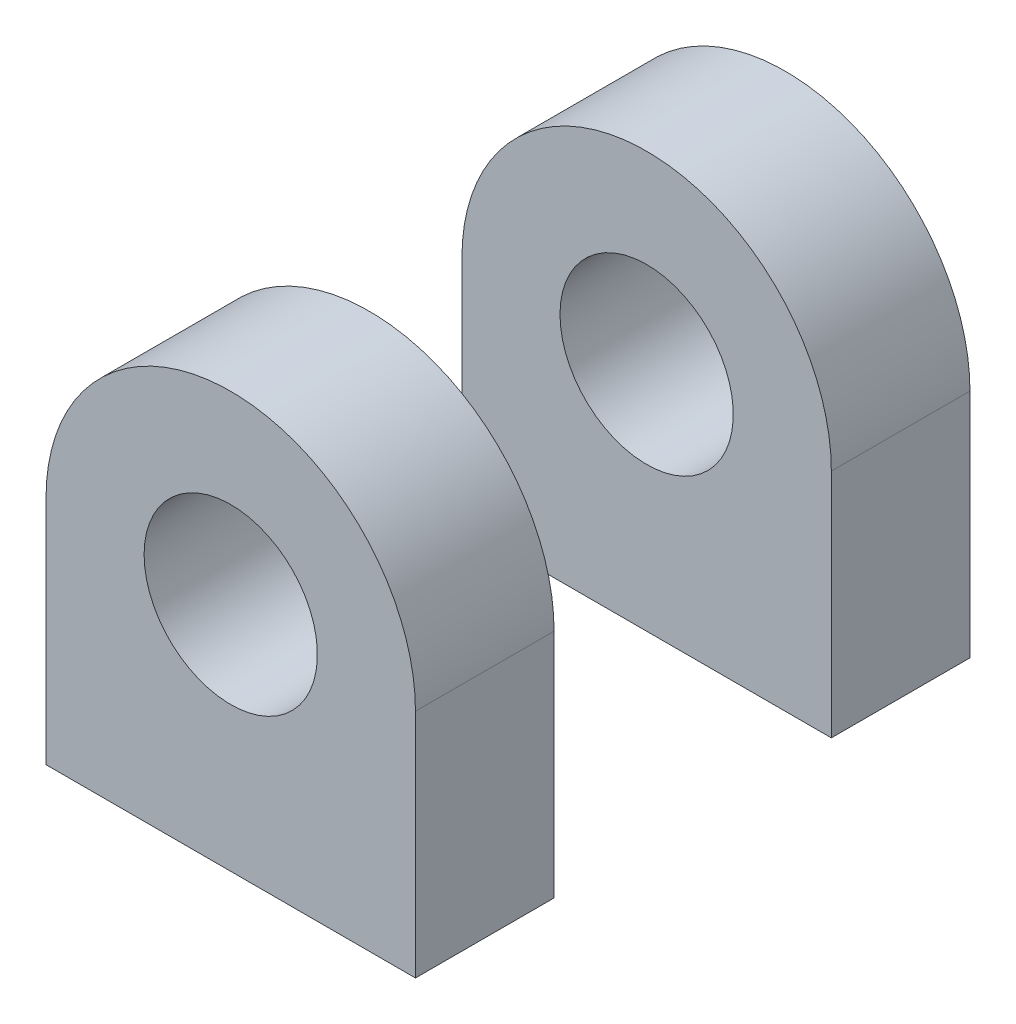
ISO-10303-21;
HEADER;
FILE_DESCRIPTION(('STEP AP214'),'2;1');
FILE_NAME('part.step','',(''),(''),'','','');
FILE_SCHEMA(('AUTOMOTIVE_DESIGN { 1 0 10303 214 1 1 1 1 }'));
ENDSEC;
DATA;
#1=APPLICATION_CONTEXT('core data for automotive mechanical design processes');
#2=APPLICATION_PROTOCOL_DEFINITION('international standard','automotive_design',2000,#1);
#3=PRODUCT_CONTEXT('',#1,'mechanical');
#4=PRODUCT('Part','Part','',(#3));
#5=PRODUCT_RELATED_PRODUCT_CATEGORY('part','',(#4));
#6=PRODUCT_DEFINITION_FORMATION('','',#4);
#7=PRODUCT_DEFINITION_CONTEXT('part definition',#1,'design');
#8=PRODUCT_DEFINITION('design','',#6,#7);
#9=PRODUCT_DEFINITION_SHAPE('','',#8);
#10=(LENGTH_UNIT() NAMED_UNIT(*) SI_UNIT(.MILLI.,.METRE.));
#11=(NAMED_UNIT(*) PLANE_ANGLE_UNIT() SI_UNIT($,.RADIAN.));
#12=(NAMED_UNIT(*) SI_UNIT($,.STERADIAN.) SOLID_ANGLE_UNIT());
#13=UNCERTAINTY_MEASURE_WITH_UNIT(LENGTH_MEASURE(1.E-05),#10,'distance_accuracy_value','');
#14=(GEOMETRIC_REPRESENTATION_CONTEXT(3) GLOBAL_UNCERTAINTY_ASSIGNED_CONTEXT((#13)) GLOBAL_UNIT_ASSIGNED_CONTEXT((#10,
#11,#12)) REPRESENTATION_CONTEXT('',''));
#15=CARTESIAN_POINT('',(0.,0.,0.));
#16=DIRECTION('',(0.,0.,1.));
#17=DIRECTION('',(1.,0.,0.));
#18=AXIS2_PLACEMENT_3D('',#15,#16,#17);
#19=CARTESIAN_POINT('',(5.0766568726894,6.35,7.62));
#20=DIRECTION('',(0.,0.,-1.));
#21=DIRECTION('',(-1.,0.,0.));
#22=AXIS2_PLACEMENT_3D('',#19,#20,#21);
#23=CYLINDRICAL_SURFACE('',#22,5.0766568726894);
#24=CARTESIAN_POINT('',(5.0766568726894,6.35,3.81));
#25=DIRECTION('',(0.,0.,1.));
#26=DIRECTION('',(1.,0.,0.));
#27=AXIS2_PLACEMENT_3D('',#24,#25,#26);
#28=CIRCLE('',#27,5.0766568726894);
#29=CARTESIAN_POINT('',(0.,6.35,3.81));
#30=VERTEX_POINT('',#29);
#31=CARTESIAN_POINT('',(10.1533137453788,6.35,3.81));
#32=VERTEX_POINT('',#31);
#33=EDGE_CURVE('E78',#30,#32,#28,.F.);
#34=ORIENTED_EDGE('',*,*,#33,.F.);
#35=DIRECTION('',(0.,0.,-1.));
#36=VECTOR('',#35,1.);
#37=CARTESIAN_POINT('',(0.,6.35,7.62));
#38=LINE('',#37,#36);
#39=CARTESIAN_POINT('',(0.,6.35,7.62));
#40=VERTEX_POINT('',#39);
#41=EDGE_CURVE('E95',#40,#30,#38,.T.);
#42=ORIENTED_EDGE('',*,*,#41,.F.);
#43=CARTESIAN_POINT('',(5.0766568726894,6.35,7.62));
#44=DIRECTION('',(0.,0.,1.));
#45=DIRECTION('',(1.,0.,0.));
#46=AXIS2_PLACEMENT_3D('',#43,#44,#45);
#47=CIRCLE('',#46,5.0766568726894);
#48=CARTESIAN_POINT('',(10.1533137453788,6.35,7.62));
#49=VERTEX_POINT('',#48);
#50=EDGE_CURVE('E98',#40,#49,#47,.F.);
#51=ORIENTED_EDGE('',*,*,#50,.T.);
#52=DIRECTION('',(0.,0.,-1.));
#53=VECTOR('',#52,1.);
#54=CARTESIAN_POINT('',(10.1533137453788,6.35,7.62));
#55=LINE('',#54,#53);
#56=EDGE_CURVE('E53',#49,#32,#55,.T.);
#57=ORIENTED_EDGE('',*,*,#56,.T.);
#58=EDGE_LOOP('',(#34,#42,#51,#57));
#59=FACE_BOUND('',#58,.T.);
#60=ADVANCED_FACE('F50',(#59),#23,.T.);
#61=CARTESIAN_POINT('',(0.,0.,7.62));
#62=DIRECTION('',(-1.,0.,0.));
#63=DIRECTION('',(0.,0.,1.));
#64=AXIS2_PLACEMENT_3D('',#61,#62,#63);
#65=PLANE('',#64);
#66=DIRECTION('',(0.,1.,0.));
#67=VECTOR('',#66,1.);
#68=CARTESIAN_POINT('',(0.,0.,3.81));
#69=LINE('',#68,#67);
#70=CARTESIAN_POINT('',(0.,0.,3.81));
#71=VERTEX_POINT('',#70);
#72=EDGE_CURVE('E12',#71,#30,#69,.T.);
#73=ORIENTED_EDGE('',*,*,#72,.F.);
#74=DIRECTION('',(0.,0.,-1.));
#75=VECTOR('',#74,1.);
#76=CARTESIAN_POINT('',(0.,0.,7.62));
#77=LINE('',#76,#75);
#78=CARTESIAN_POINT('',(0.,0.,7.62));
#79=VERTEX_POINT('',#78);
#80=EDGE_CURVE('E89',#79,#71,#77,.T.);
#81=ORIENTED_EDGE('',*,*,#80,.F.);
#82=DIRECTION('',(0.,1.,0.));
#83=VECTOR('',#82,1.);
#84=CARTESIAN_POINT('',(0.,0.,7.62));
#85=LINE('',#84,#83);
#86=EDGE_CURVE('E99',#79,#40,#85,.T.);
#87=ORIENTED_EDGE('',*,*,#86,.T.);
#88=ORIENTED_EDGE('',*,*,#41,.T.);
#89=EDGE_LOOP('',(#73,#81,#87,#88));
#90=FACE_BOUND('',#89,.T.);
#91=ADVANCED_FACE('F108',(#90),#65,.T.);
#92=CARTESIAN_POINT('',(0.,0.,7.62));
#93=DIRECTION('',(0.,1.,0.));
#94=DIRECTION('',(0.,0.,1.));
#95=AXIS2_PLACEMENT_3D('',#92,#93,#94);
#96=PLANE('',#95);
#97=ORIENTED_EDGE('',*,*,#80,.T.);
#98=DIRECTION('',(-1.,0.,0.));
#99=VECTOR('',#98,1.);
#100=CARTESIAN_POINT('',(25.4,0.,3.81));
#101=LINE('',#100,#99);
#102=CARTESIAN_POINT('',(10.1533137453788,0.,3.81));
#103=VERTEX_POINT('',#102);
#104=EDGE_CURVE('E59',#103,#71,#101,.T.);
#105=ORIENTED_EDGE('',*,*,#104,.F.);
#106=DIRECTION('',(0.,0.,-1.));
#107=VECTOR('',#106,1.);
#108=CARTESIAN_POINT('',(10.1533137453788,0.,7.62));
#109=LINE('',#108,#107);
#110=CARTESIAN_POINT('',(10.1533137453788,0.,7.62));
#111=VERTEX_POINT('',#110);
#112=EDGE_CURVE('E117',#111,#103,#109,.T.);
#113=ORIENTED_EDGE('',*,*,#112,.F.);
#114=DIRECTION('',(1.,0.,0.));
#115=VECTOR('',#114,1.);
#116=CARTESIAN_POINT('',(0.,0.,7.62));
#117=LINE('',#116,#115);
#118=EDGE_CURVE('E111',#79,#111,#117,.T.);
#119=ORIENTED_EDGE('',*,*,#118,.F.);
#120=EDGE_LOOP('',(#97,#105,#113,#119));
#121=FACE_BOUND('',#120,.T.);
#122=ADVANCED_FACE('F128',(#121),#96,.F.);
#123=CARTESIAN_POINT('',(5.0766568726894,6.35,7.62));
#124=DIRECTION('',(0.,0.,-1.));
#125=DIRECTION('',(-1.,0.,0.));
#126=AXIS2_PLACEMENT_3D('',#123,#124,#125);
#127=CYLINDRICAL_SURFACE('',#126,2.38125);
#128=CARTESIAN_POINT('',(5.0766568726894,6.35,3.81));
#129=DIRECTION('',(0.,0.,1.));
#130=DIRECTION('',(1.,0.,0.));
#131=AXIS2_PLACEMENT_3D('',#128,#129,#130);
#132=CIRCLE('',#131,2.38125);
#133=CARTESIAN_POINT('',(2.6954068726894,6.35,3.81));
#134=VERTEX_POINT('',#133);
#135=EDGE_CURVE('E118',#134,#134,#132,.T.);
#136=CARTESIAN_POINT('',(5.0766568726894,6.35,7.62));
#137=DIRECTION('',(0.,0.,1.));
#138=DIRECTION('',(1.,0.,0.));
#139=AXIS2_PLACEMENT_3D('',#136,#137,#138);
#140=CIRCLE('',#139,2.38125);
#141=CARTESIAN_POINT('',(2.6954068726894,6.35,7.62));
#142=VERTEX_POINT('',#141);
#143=EDGE_CURVE('E114',#142,#142,#140,.T.);
#144=CARTESIAN_POINT('',(2.6954068726894,6.35,3.81));
#145=CARTESIAN_POINT('',(2.6954068726894,6.35,3.8496875));
#146=CARTESIAN_POINT('',(2.6954068726894,6.35,3.889375));
#147=CARTESIAN_POINT('',(2.6954068726894,6.35,3.96875));
#148=CARTESIAN_POINT('',(2.6954068726894,6.35,4.0084375));
#149=CARTESIAN_POINT('',(2.6954068726894,6.35,4.0878125));
#150=CARTESIAN_POINT('',(2.6954068726894,6.35,4.1275));
#151=CARTESIAN_POINT('',(2.6954068726894,6.35,4.206875));
#152=CARTESIAN_POINT('',(2.6954068726894,6.35,4.2465625));
#153=CARTESIAN_POINT('',(2.6954068726894,6.35,4.3259375));
#154=CARTESIAN_POINT('',(2.6954068726894,6.35,4.365625));
#155=CARTESIAN_POINT('',(2.6954068726894,6.35,4.445));
#156=CARTESIAN_POINT('',(2.6954068726894,6.35,4.4846875));
#157=CARTESIAN_POINT('',(2.6954068726894,6.35,4.5640625));
#158=CARTESIAN_POINT('',(2.6954068726894,6.35,4.60375));
#159=CARTESIAN_POINT('',(2.6954068726894,6.35,4.683125));
#160=CARTESIAN_POINT('',(2.6954068726894,6.35,4.7228125));
#161=CARTESIAN_POINT('',(2.6954068726894,6.35,4.8021875));
#162=CARTESIAN_POINT('',(2.6954068726894,6.35,4.841875));
#163=CARTESIAN_POINT('',(2.6954068726894,6.35,4.92125));
#164=CARTESIAN_POINT('',(2.6954068726894,6.35,4.9609375));
#165=CARTESIAN_POINT('',(2.6954068726894,6.35,5.0403125));
#166=CARTESIAN_POINT('',(2.6954068726894,6.35,5.08));
#167=CARTESIAN_POINT('',(2.6954068726894,6.35,5.159375));
#168=CARTESIAN_POINT('',(2.6954068726894,6.35,5.1990625));
#169=CARTESIAN_POINT('',(2.6954068726894,6.35,5.2784375));
#170=CARTESIAN_POINT('',(2.6954068726894,6.35,5.318125));
#171=CARTESIAN_POINT('',(2.6954068726894,6.35,5.3975));
#172=CARTESIAN_POINT('',(2.6954068726894,6.35,5.4371875));
#173=CARTESIAN_POINT('',(2.6954068726894,6.35,5.5165625));
#174=CARTESIAN_POINT('',(2.6954068726894,6.35,5.55625));
#175=CARTESIAN_POINT('',(2.6954068726894,6.35,5.635625));
#176=CARTESIAN_POINT('',(2.6954068726894,6.35,5.6753125));
#177=CARTESIAN_POINT('',(2.6954068726894,6.35,5.7546875));
#178=CARTESIAN_POINT('',(2.6954068726894,6.35,5.794375));
#179=CARTESIAN_POINT('',(2.6954068726894,6.35,5.87375));
#180=CARTESIAN_POINT('',(2.6954068726894,6.35,5.9134375));
#181=CARTESIAN_POINT('',(2.6954068726894,6.35,5.9928125));
#182=CARTESIAN_POINT('',(2.6954068726894,6.35,6.0325));
#183=CARTESIAN_POINT('',(2.6954068726894,6.35,6.111875));
#184=CARTESIAN_POINT('',(2.6954068726894,6.35,6.1515625));
#185=CARTESIAN_POINT('',(2.6954068726894,6.35,6.2309375));
#186=CARTESIAN_POINT('',(2.6954068726894,6.35,6.270625));
#187=CARTESIAN_POINT('',(2.6954068726894,6.35,6.35));
#188=CARTESIAN_POINT('',(2.6954068726894,6.35,6.3896875));
#189=CARTESIAN_POINT('',(2.6954068726894,6.35,6.4690625));
#190=CARTESIAN_POINT('',(2.6954068726894,6.35,6.50875));
#191=CARTESIAN_POINT('',(2.6954068726894,6.35,6.588125));
#192=CARTESIAN_POINT('',(2.6954068726894,6.35,6.6278125));
#193=CARTESIAN_POINT('',(2.6954068726894,6.35,6.7071875));
#194=CARTESIAN_POINT('',(2.6954068726894,6.35,6.746875));
#195=CARTESIAN_POINT('',(2.6954068726894,6.35,6.82625));
#196=CARTESIAN_POINT('',(2.6954068726894,6.35,6.8659375));
#197=CARTESIAN_POINT('',(2.6954068726894,6.35,6.9453125));
#198=CARTESIAN_POINT('',(2.6954068726894,6.35,6.985));
#199=CARTESIAN_POINT('',(2.6954068726894,6.35,7.064375));
#200=CARTESIAN_POINT('',(2.6954068726894,6.35,7.1040625));
#201=CARTESIAN_POINT('',(2.6954068726894,6.35,7.1834375));
#202=CARTESIAN_POINT('',(2.6954068726894,6.35,7.223125));
#203=CARTESIAN_POINT('',(2.6954068726894,6.35,7.3025));
#204=CARTESIAN_POINT('',(2.6954068726894,6.35,7.3421875));
#205=CARTESIAN_POINT('',(2.6954068726894,6.35,7.4215625));
#206=CARTESIAN_POINT('',(2.6954068726894,6.35,7.46125));
#207=CARTESIAN_POINT('',(2.6954068726894,6.35,7.540625));
#208=CARTESIAN_POINT('',(2.6954068726894,6.35,7.5803125));
#209=CARTESIAN_POINT('',(2.6954068726894,6.35,7.62));
#210=B_SPLINE_CURVE_WITH_KNOTS('',3,(#144,#145,#146,#147,#148,#149,#150,#151,#152,#153,#154,
#155,#156,#157,#158,#159,#160,#161,#162,#163,#164,#165,#166,#167,#168,#169,#170,#171,#172,#173,
#174,#175,#176,#177,#178,#179,#180,#181,#182,#183,#184,#185,#186,#187,#188,#189,#190,#191,#192,
#193,#194,#195,#196,#197,#198,#199,#200,#201,#202,#203,#204,#205,#206,#207,#208,#209),
.UNSPECIFIED.,.F.,.F.,(4,2,2,2,2,2,2,2,2,2,2,2,2,2,2,2,2,2,2,2,2,2,2,2,2,2,2,2,2,2,2,2,4),(0.,
0.1190625,0.238125,0.357187499999999,0.476250000000001,0.5953125,0.714374999999999,0.8334375,
0.9525,1.0715625,1.190625,1.3096875,1.42875,1.5478125,1.666875,1.7859375,1.905,2.0240625,
2.143125,2.2621875,2.38125,2.5003125,2.619375,2.7384375,2.8575,2.9765625,3.095625,3.2146875,
3.33375,3.4528125,3.571875,3.6909375,3.81),.UNSPECIFIED.);
#211=EDGE_CURVE('BSEAM147',#134,#142,#210,.T.);
#212=ORIENTED_EDGE('',*,*,#135,.F.);
#213=ORIENTED_EDGE('',*,*,#143,.T.);
#214=ORIENTED_EDGE('',*,*,#211,.T.);
#215=ORIENTED_EDGE('',*,*,#211,.F.);
#216=EDGE_LOOP('',(#212,#214,#213,#215));
#217=FACE_BOUND('',#216,.T.);
#218=ADVANCED_FACE('F147',(#217),#127,.F.);
#219=CARTESIAN_POINT('',(10.1533137453788,0.,7.62));
#220=DIRECTION('',(-1.,0.,0.));
#221=DIRECTION('',(0.,0.,1.));
#222=AXIS2_PLACEMENT_3D('',#219,#220,#221);
#223=PLANE('',#222);
#224=ORIENTED_EDGE('',*,*,#112,.T.);
#225=DIRECTION('',(0.,1.,0.));
#226=VECTOR('',#225,1.);
#227=CARTESIAN_POINT('',(10.1533137453788,0.,3.81));
#228=LINE('',#227,#226);
#229=EDGE_CURVE('E74',#103,#32,#228,.T.);
#230=ORIENTED_EDGE('',*,*,#229,.T.);
#231=ORIENTED_EDGE('',*,*,#56,.F.);
#232=DIRECTION('',(0.,1.,0.));
#233=VECTOR('',#232,1.);
#234=CARTESIAN_POINT('',(10.1533137453788,0.,7.62));
#235=LINE('',#234,#233);
#236=EDGE_CURVE('E105',#111,#49,#235,.T.);
#237=ORIENTED_EDGE('',*,*,#236,.F.);
#238=EDGE_LOOP('',(#224,#230,#231,#237));
#239=FACE_BOUND('',#238,.T.);
#240=ADVANCED_FACE('F136',(#239),#223,.F.);
#241=CARTESIAN_POINT('',(0.,0.,7.62));
#242=DIRECTION('',(0.,0.,1.));
#243=DIRECTION('',(1.,0.,0.));
#244=AXIS2_PLACEMENT_3D('',#241,#242,#243);
#245=PLANE('',#244);
#246=ORIENTED_EDGE('',*,*,#143,.F.);
#247=EDGE_LOOP('',(#246));
#248=FACE_BOUND('',#247,.T.);
#249=ORIENTED_EDGE('',*,*,#50,.F.);
#250=ORIENTED_EDGE('',*,*,#86,.F.);
#251=ORIENTED_EDGE('',*,*,#118,.T.);
#252=ORIENTED_EDGE('',*,*,#236,.T.);
#253=EDGE_LOOP('',(#249,#250,#251,#252));
#254=FACE_BOUND('',#253,.T.);
#255=ADVANCED_FACE('F103',(#248,#254),#245,.T.);
#256=CARTESIAN_POINT('',(25.4,0.,3.81));
#257=DIRECTION('',(0.,0.,1.));
#258=DIRECTION('',(1.,0.,0.));
#259=AXIS2_PLACEMENT_3D('',#256,#257,#258);
#260=PLANE('',#259);
#261=ORIENTED_EDGE('',*,*,#135,.T.);
#262=EDGE_LOOP('',(#261));
#263=FACE_BOUND('',#262,.T.);
#264=ORIENTED_EDGE('',*,*,#33,.T.);
#265=ORIENTED_EDGE('',*,*,#229,.F.);
#266=ORIENTED_EDGE('',*,*,#104,.T.);
#267=ORIENTED_EDGE('',*,*,#72,.T.);
#268=EDGE_LOOP('',(#264,#265,#266,#267));
#269=FACE_BOUND('',#268,.T.);
#270=ADVANCED_FACE('F129',(#263,#269),#260,.F.);
#271=CLOSED_SHELL('',(#60,#91,#122,#218,#240,#255,#270));
#272=MANIFOLD_SOLID_BREP('B2',#271);
#273=CARTESIAN_POINT('',(5.0766568726894,6.35,7.62));
#274=DIRECTION('',(0.,0.,-1.));
#275=DIRECTION('',(-1.,0.,0.));
#276=AXIS2_PLACEMENT_3D('',#273,#274,#275);
#277=CYLINDRICAL_SURFACE('',#276,2.38125);
#278=CARTESIAN_POINT('',(5.0766568726894,6.35,-7.62));
#279=DIRECTION('',(0.,0.,1.));
#280=DIRECTION('',(1.,0.,0.));
#281=AXIS2_PLACEMENT_3D('',#278,#279,#280);
#282=CIRCLE('',#281,2.38125);
#283=CARTESIAN_POINT('',(2.6954068726894,6.35,-7.62));
#284=VERTEX_POINT('',#283);
#285=EDGE_CURVE('E278',#284,#284,#282,.T.);
#286=CARTESIAN_POINT('',(5.0766568726894,6.35,-3.81));
#287=DIRECTION('',(0.,0.,1.));
#288=DIRECTION('',(0.,-1.,0.));
#289=AXIS2_PLACEMENT_3D('',#286,#287,#288);
#290=CIRCLE('',#289,2.38125);
#291=CARTESIAN_POINT('',(2.6954068726894,6.35,-3.81));
#292=VERTEX_POINT('',#291);
#293=EDGE_CURVE('E281',#292,#292,#290,.T.);
#294=CARTESIAN_POINT('',(2.6954068726894,6.35,-7.62));
#295=CARTESIAN_POINT('',(2.6954068726894,6.35,-7.5803125));
#296=CARTESIAN_POINT('',(2.6954068726894,6.35,-7.540625));
#297=CARTESIAN_POINT('',(2.6954068726894,6.35,-7.46125));
#298=CARTESIAN_POINT('',(2.6954068726894,6.35,-7.4215625));
#299=CARTESIAN_POINT('',(2.6954068726894,6.35,-7.3421875));
#300=CARTESIAN_POINT('',(2.6954068726894,6.35,-7.3025));
#301=CARTESIAN_POINT('',(2.6954068726894,6.35,-7.223125));
#302=CARTESIAN_POINT('',(2.6954068726894,6.35,-7.1834375));
#303=CARTESIAN_POINT('',(2.6954068726894,6.35,-7.1040625));
#304=CARTESIAN_POINT('',(2.6954068726894,6.35,-7.064375));
#305=CARTESIAN_POINT('',(2.6954068726894,6.35,-6.985));
#306=CARTESIAN_POINT('',(2.6954068726894,6.35,-6.9453125));
#307=CARTESIAN_POINT('',(2.6954068726894,6.35,-6.8659375));
#308=CARTESIAN_POINT('',(2.6954068726894,6.35,-6.82625));
#309=CARTESIAN_POINT('',(2.6954068726894,6.35,-6.746875));
#310=CARTESIAN_POINT('',(2.6954068726894,6.35,-6.7071875));
#311=CARTESIAN_POINT('',(2.6954068726894,6.35,-6.6278125));
#312=CARTESIAN_POINT('',(2.6954068726894,6.35,-6.588125));
#313=CARTESIAN_POINT('',(2.6954068726894,6.35,-6.50875));
#314=CARTESIAN_POINT('',(2.6954068726894,6.35,-6.4690625));
#315=CARTESIAN_POINT('',(2.6954068726894,6.35,-6.3896875));
#316=CARTESIAN_POINT('',(2.6954068726894,6.35,-6.35));
#317=CARTESIAN_POINT('',(2.6954068726894,6.35,-6.270625));
#318=CARTESIAN_POINT('',(2.6954068726894,6.35,-6.2309375));
#319=CARTESIAN_POINT('',(2.6954068726894,6.35,-6.1515625));
#320=CARTESIAN_POINT('',(2.6954068726894,6.35,-6.111875));
#321=CARTESIAN_POINT('',(2.6954068726894,6.35,-6.0325));
#322=CARTESIAN_POINT('',(2.6954068726894,6.35,-5.9928125));
#323=CARTESIAN_POINT('',(2.6954068726894,6.35,-5.9134375));
#324=CARTESIAN_POINT('',(2.6954068726894,6.35,-5.87375));
#325=CARTESIAN_POINT('',(2.6954068726894,6.35,-5.794375));
#326=CARTESIAN_POINT('',(2.6954068726894,6.35,-5.7546875));
#327=CARTESIAN_POINT('',(2.6954068726894,6.35,-5.6753125));
#328=CARTESIAN_POINT('',(2.6954068726894,6.35,-5.635625));
#329=CARTESIAN_POINT('',(2.6954068726894,6.35,-5.55625));
#330=CARTESIAN_POINT('',(2.6954068726894,6.35,-5.5165625));
#331=CARTESIAN_POINT('',(2.6954068726894,6.35,-5.4371875));
#332=CARTESIAN_POINT('',(2.6954068726894,6.35,-5.3975));
#333=CARTESIAN_POINT('',(2.6954068726894,6.35,-5.318125));
#334=CARTESIAN_POINT('',(2.6954068726894,6.35,-5.2784375));
#335=CARTESIAN_POINT('',(2.6954068726894,6.35,-5.1990625));
#336=CARTESIAN_POINT('',(2.6954068726894,6.35,-5.159375));
#337=CARTESIAN_POINT('',(2.6954068726894,6.35,-5.08));
#338=CARTESIAN_POINT('',(2.6954068726894,6.35,-5.0403125));
#339=CARTESIAN_POINT('',(2.6954068726894,6.35,-4.9609375));
#340=CARTESIAN_POINT('',(2.6954068726894,6.35,-4.92125));
#341=CARTESIAN_POINT('',(2.6954068726894,6.35,-4.841875));
#342=CARTESIAN_POINT('',(2.6954068726894,6.35,-4.8021875));
#343=CARTESIAN_POINT('',(2.6954068726894,6.35,-4.7228125));
#344=CARTESIAN_POINT('',(2.6954068726894,6.35,-4.683125));
#345=CARTESIAN_POINT('',(2.6954068726894,6.35,-4.60375));
#346=CARTESIAN_POINT('',(2.6954068726894,6.35,-4.5640625));
#347=CARTESIAN_POINT('',(2.6954068726894,6.35,-4.4846875));
#348=CARTESIAN_POINT('',(2.6954068726894,6.35,-4.445));
#349=CARTESIAN_POINT('',(2.6954068726894,6.35,-4.365625));
#350=CARTESIAN_POINT('',(2.6954068726894,6.35,-4.3259375));
#351=CARTESIAN_POINT('',(2.6954068726894,6.35,-4.2465625));
#352=CARTESIAN_POINT('',(2.6954068726894,6.35,-4.206875));
#353=CARTESIAN_POINT('',(2.6954068726894,6.35,-4.1275));
#354=CARTESIAN_POINT('',(2.6954068726894,6.35,-4.0878125));
#355=CARTESIAN_POINT('',(2.6954068726894,6.35,-4.0084375));
#356=CARTESIAN_POINT('',(2.6954068726894,6.35,-3.96875));
#357=CARTESIAN_POINT('',(2.6954068726894,6.35,-3.889375));
#358=CARTESIAN_POINT('',(2.6954068726894,6.35,-3.8496875));
#359=CARTESIAN_POINT('',(2.6954068726894,6.35,-3.81));
#360=B_SPLINE_CURVE_WITH_KNOTS('',3,(#294,#295,#296,#297,#298,#299,#300,#301,#302,#303,#304,
#305,#306,#307,#308,#309,#310,#311,#312,#313,#314,#315,#316,#317,#318,#319,#320,#321,#322,#323,
#324,#325,#326,#327,#328,#329,#330,#331,#332,#333,#334,#335,#336,#337,#338,#339,#340,#341,#342,
#343,#344,#345,#346,#347,#348,#349,#350,#351,#352,#353,#354,#355,#356,#357,#358,#359),
.UNSPECIFIED.,.F.,.F.,(4,2,2,2,2,2,2,2,2,2,2,2,2,2,2,2,2,2,2,2,2,2,2,2,2,2,2,2,2,2,2,2,4),(0.,
0.119062499999999,0.238125,0.3571875,0.476249999999999,0.5953125,0.714375,0.833437499999999,
0.952499999999998,1.0715625,1.190625,1.3096875,1.42875,1.5478125,1.666875,1.7859375,1.905,
2.0240625,2.143125,2.2621875,2.38125,2.5003125,2.619375,2.7384375,2.8575,2.9765625,3.095625,
3.2146875,3.33375,3.4528125,3.571875,3.6909375,3.81),.UNSPECIFIED.);
#361=EDGE_CURVE('BSEAM208',#284,#292,#360,.T.);
#362=ORIENTED_EDGE('',*,*,#285,.F.);
#363=ORIENTED_EDGE('',*,*,#293,.T.);
#364=ORIENTED_EDGE('',*,*,#361,.T.);
#365=ORIENTED_EDGE('',*,*,#361,.F.);
#366=EDGE_LOOP('',(#362,#364,#363,#365));
#367=FACE_BOUND('',#366,.T.);
#368=ADVANCED_FACE('F208',(#367),#277,.F.);
#369=CARTESIAN_POINT('',(0.,0.,-7.62));
#370=DIRECTION('',(0.,0.,1.));
#371=DIRECTION('',(1.,0.,0.));
#372=AXIS2_PLACEMENT_3D('',#369,#370,#371);
#373=PLANE('',#372);
#374=ORIENTED_EDGE('',*,*,#285,.T.);
#375=EDGE_LOOP('',(#374));
#376=FACE_BOUND('',#375,.T.);
#377=CARTESIAN_POINT('',(5.0766568726894,6.35,-7.62));
#378=DIRECTION('',(0.,0.,1.));
#379=DIRECTION('',(1.,0.,0.));
#380=AXIS2_PLACEMENT_3D('',#377,#378,#379);
#381=CIRCLE('',#380,5.0766568726894);
#382=CARTESIAN_POINT('',(0.,6.35,-7.62));
#383=VERTEX_POINT('',#382);
#384=CARTESIAN_POINT('',(10.1533137453788,6.35,-7.62));
#385=VERTEX_POINT('',#384);
#386=EDGE_CURVE('E275',#383,#385,#381,.F.);
#387=ORIENTED_EDGE('',*,*,#386,.T.);
#388=DIRECTION('',(0.,1.,0.));
#389=VECTOR('',#388,1.);
#390=CARTESIAN_POINT('',(10.1533137453788,0.,-7.62));
#391=LINE('',#390,#389);
#392=CARTESIAN_POINT('',(10.1533137453788,0.,-7.62));
#393=VERTEX_POINT('',#392);
#394=EDGE_CURVE('E270',#393,#385,#391,.T.);
#395=ORIENTED_EDGE('',*,*,#394,.F.);
#396=DIRECTION('',(1.,0.,0.));
#397=VECTOR('',#396,1.);
#398=CARTESIAN_POINT('',(0.,0.,-7.62));
#399=LINE('',#398,#397);
#400=CARTESIAN_POINT('',(0.,0.,-7.62));
#401=VERTEX_POINT('',#400);
#402=EDGE_CURVE('E272',#401,#393,#399,.T.);
#403=ORIENTED_EDGE('',*,*,#402,.F.);
#404=DIRECTION('',(0.,1.,0.));
#405=VECTOR('',#404,1.);
#406=CARTESIAN_POINT('',(0.,0.,-7.62));
#407=LINE('',#406,#405);
#408=EDGE_CURVE('E265',#401,#383,#407,.T.);
#409=ORIENTED_EDGE('',*,*,#408,.T.);
#410=EDGE_LOOP('',(#387,#395,#403,#409));
#411=FACE_BOUND('',#410,.T.);
#412=ADVANCED_FACE('F289',(#376,#411),#373,.F.);
#413=CARTESIAN_POINT('',(10.1533137453788,0.,7.62));
#414=DIRECTION('',(-1.,0.,0.));
#415=DIRECTION('',(0.,0.,1.));
#416=AXIS2_PLACEMENT_3D('',#413,#414,#415);
#417=PLANE('',#416);
#418=DIRECTION('',(0.,1.,0.));
#419=VECTOR('',#418,1.);
#420=CARTESIAN_POINT('',(10.1533137453788,0.,-3.81));
#421=LINE('',#420,#419);
#422=CARTESIAN_POINT('',(10.1533137453788,0.,-3.81));
#423=VERTEX_POINT('',#422);
#424=CARTESIAN_POINT('',(10.1533137453788,6.35,-3.81));
#425=VERTEX_POINT('',#424);
#426=EDGE_CURVE('E48',#423,#425,#421,.T.);
#427=ORIENTED_EDGE('',*,*,#426,.F.);
#428=DIRECTION('',(0.,0.,-1.));
#429=VECTOR('',#428,1.);
#430=CARTESIAN_POINT('',(10.1533137453788,0.,7.62));
#431=LINE('',#430,#429);
#432=EDGE_CURVE('E260',#423,#393,#431,.T.);
#433=ORIENTED_EDGE('',*,*,#432,.T.);
#434=ORIENTED_EDGE('',*,*,#394,.T.);
#435=DIRECTION('',(0.,0.,-1.));
#436=VECTOR('',#435,1.);
#437=CARTESIAN_POINT('',(10.1533137453788,6.35,7.62));
#438=LINE('',#437,#436);
#439=EDGE_CURVE('E229',#425,#385,#438,.T.);
#440=ORIENTED_EDGE('',*,*,#439,.F.);
#441=EDGE_LOOP('',(#427,#433,#434,#440));
#442=FACE_BOUND('',#441,.T.);
#443=ADVANCED_FACE('F286',(#442),#417,.F.);
#444=CARTESIAN_POINT('',(0.,0.,7.62));
#445=DIRECTION('',(0.,1.,0.));
#446=DIRECTION('',(0.,0.,1.));
#447=AXIS2_PLACEMENT_3D('',#444,#445,#446);
#448=PLANE('',#447);
#449=DIRECTION('',(-1.,0.,0.));
#450=VECTOR('',#449,1.);
#451=CARTESIAN_POINT('',(25.4,0.,-3.81));
#452=LINE('',#451,#450);
#453=CARTESIAN_POINT('',(0.,0.,-3.81));
#454=VERTEX_POINT('',#453);
#455=EDGE_CURVE('E221',#423,#454,#452,.T.);
#456=ORIENTED_EDGE('',*,*,#455,.T.);
#457=DIRECTION('',(0.,0.,-1.));
#458=VECTOR('',#457,1.);
#459=CARTESIAN_POINT('',(0.,0.,7.62));
#460=LINE('',#459,#458);
#461=EDGE_CURVE('E258',#454,#401,#460,.T.);
#462=ORIENTED_EDGE('',*,*,#461,.T.);
#463=ORIENTED_EDGE('',*,*,#402,.T.);
#464=ORIENTED_EDGE('',*,*,#432,.F.);
#465=EDGE_LOOP('',(#456,#462,#463,#464));
#466=FACE_BOUND('',#465,.T.);
#467=ADVANCED_FACE('F256',(#466),#448,.F.);
#468=CARTESIAN_POINT('',(0.,0.,7.62));
#469=DIRECTION('',(-1.,0.,0.));
#470=DIRECTION('',(0.,0.,1.));
#471=AXIS2_PLACEMENT_3D('',#468,#469,#470);
#472=PLANE('',#471);
#473=ORIENTED_EDGE('',*,*,#461,.F.);
#474=DIRECTION('',(0.,1.,0.));
#475=VECTOR('',#474,1.);
#476=CARTESIAN_POINT('',(0.,0.,-3.81));
#477=LINE('',#476,#475);
#478=CARTESIAN_POINT('',(0.,6.35,-3.81));
#479=VERTEX_POINT('',#478);
#480=EDGE_CURVE('E247',#454,#479,#477,.T.);
#481=ORIENTED_EDGE('',*,*,#480,.T.);
#482=DIRECTION('',(0.,0.,-1.));
#483=VECTOR('',#482,1.);
#484=CARTESIAN_POINT('',(0.,6.35,7.62));
#485=LINE('',#484,#483);
#486=EDGE_CURVE('E215',#479,#383,#485,.T.);
#487=ORIENTED_EDGE('',*,*,#486,.T.);
#488=ORIENTED_EDGE('',*,*,#408,.F.);
#489=EDGE_LOOP('',(#473,#481,#487,#488));
#490=FACE_BOUND('',#489,.T.);
#491=ADVANCED_FACE('F263',(#490),#472,.T.);
#492=CARTESIAN_POINT('',(5.0766568726894,6.35,7.62));
#493=DIRECTION('',(0.,0.,-1.));
#494=DIRECTION('',(-1.,0.,0.));
#495=AXIS2_PLACEMENT_3D('',#492,#493,#494);
#496=CYLINDRICAL_SURFACE('',#495,5.0766568726894);
#497=ORIENTED_EDGE('',*,*,#486,.F.);
#498=CARTESIAN_POINT('',(5.0766568726894,6.35,-3.81));
#499=DIRECTION('',(0.,0.,1.));
#500=DIRECTION('',(0.,-1.,0.));
#501=AXIS2_PLACEMENT_3D('',#498,#499,#500);
#502=CIRCLE('',#501,5.0766568726894);
#503=EDGE_CURVE('E249',#479,#425,#502,.F.);
#504=ORIENTED_EDGE('',*,*,#503,.T.);
#505=ORIENTED_EDGE('',*,*,#439,.T.);
#506=ORIENTED_EDGE('',*,*,#386,.F.);
#507=EDGE_LOOP('',(#497,#504,#505,#506));
#508=FACE_BOUND('',#507,.T.);
#509=ADVANCED_FACE('F284',(#508),#496,.T.);
#510=CARTESIAN_POINT('',(25.4,0.,-3.81));
#511=DIRECTION('',(0.,0.,1.));
#512=DIRECTION('',(0.,-1.,0.));
#513=AXIS2_PLACEMENT_3D('',#510,#511,#512);
#514=PLANE('',#513);
#515=ORIENTED_EDGE('',*,*,#293,.F.);
#516=EDGE_LOOP('',(#515));
#517=FACE_BOUND('',#516,.T.);
#518=ORIENTED_EDGE('',*,*,#480,.F.);
#519=ORIENTED_EDGE('',*,*,#455,.F.);
#520=ORIENTED_EDGE('',*,*,#426,.T.);
#521=ORIENTED_EDGE('',*,*,#503,.F.);
#522=EDGE_LOOP('',(#518,#519,#520,#521));
#523=FACE_BOUND('',#522,.T.);
#524=ADVANCED_FACE('F248',(#517,#523),#514,.T.);
#525=CLOSED_SHELL('',(#368,#412,#443,#467,#491,#509,#524));
#526=MANIFOLD_SOLID_BREP('B6',#525);
#527=ADVANCED_BREP_SHAPE_REPRESENTATION('',(#18,#272,#526),#14);
#528=SHAPE_DEFINITION_REPRESENTATION(#9,#527);
ENDSEC;
END-ISO-10303-21;
